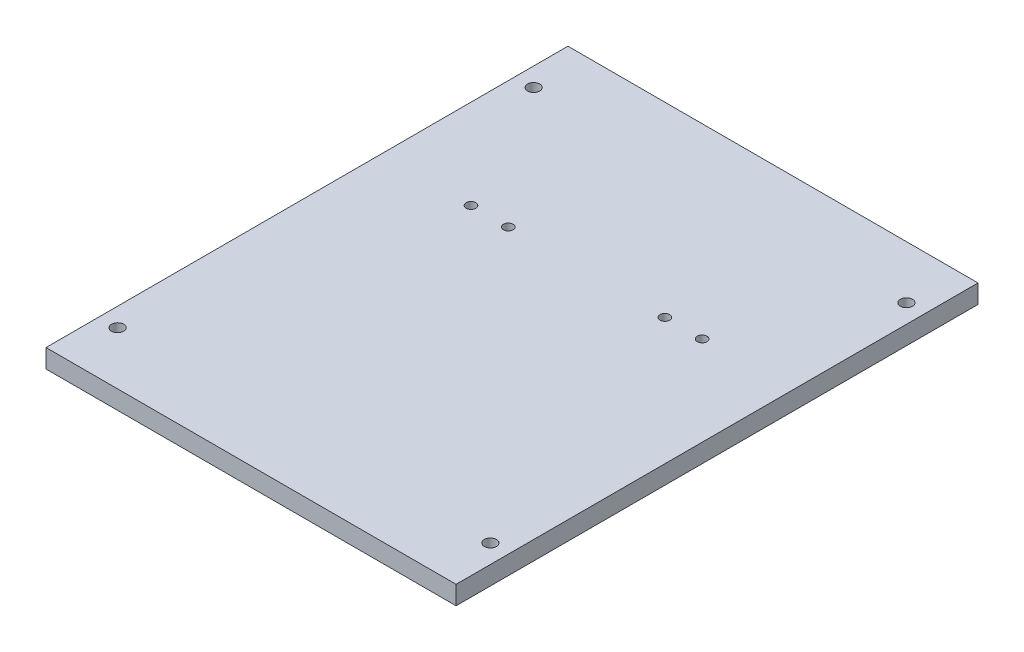
ISO-10303-21;
HEADER;
FILE_DESCRIPTION(('STEP AP214'),'2;1');
FILE_NAME('part.step','',(''),(''),'','','');
FILE_SCHEMA(('AUTOMOTIVE_DESIGN { 1 0 10303 214 1 1 1 1 }'));
ENDSEC;
DATA;
#1=APPLICATION_CONTEXT('core data for automotive mechanical design processes');
#2=APPLICATION_PROTOCOL_DEFINITION('international standard','automotive_design',2000,#1);
#3=PRODUCT_CONTEXT('',#1,'mechanical');
#4=PRODUCT('Part','Part','',(#3));
#5=PRODUCT_RELATED_PRODUCT_CATEGORY('part','',(#4));
#6=PRODUCT_DEFINITION_FORMATION('','',#4);
#7=PRODUCT_DEFINITION_CONTEXT('part definition',#1,'design');
#8=PRODUCT_DEFINITION('design','',#6,#7);
#9=PRODUCT_DEFINITION_SHAPE('','',#8);
#10=(LENGTH_UNIT() NAMED_UNIT(*) SI_UNIT(.MILLI.,.METRE.));
#11=(NAMED_UNIT(*) PLANE_ANGLE_UNIT() SI_UNIT($,.RADIAN.));
#12=(NAMED_UNIT(*) SI_UNIT($,.STERADIAN.) SOLID_ANGLE_UNIT());
#13=UNCERTAINTY_MEASURE_WITH_UNIT(LENGTH_MEASURE(1.E-05),#10,'distance_accuracy_value','');
#14=(GEOMETRIC_REPRESENTATION_CONTEXT(3) GLOBAL_UNCERTAINTY_ASSIGNED_CONTEXT((#13)) GLOBAL_UNIT_ASSIGNED_CONTEXT((#10,
#11,#12)) REPRESENTATION_CONTEXT('',''));
#15=CARTESIAN_POINT('',(0.,0.,0.));
#16=DIRECTION('',(0.,0.,1.));
#17=DIRECTION('',(1.,0.,0.));
#18=AXIS2_PLACEMENT_3D('',#15,#16,#17);
#19=CARTESIAN_POINT('',(0.,6.35,0.));
#20=DIRECTION('',(0.,-1.,0.));
#21=DIRECTION('',(0.,0.,-1.));
#22=AXIS2_PLACEMENT_3D('',#19,#20,#21);
#23=PLANE('',#22);
#24=DIRECTION('',(0.,0.,-1.));
#25=VECTOR('',#24,1.);
#26=CARTESIAN_POINT('',(139.7,6.35,-190.5));
#27=LINE('',#26,#25);
#28=CARTESIAN_POINT('',(139.7,6.35,-12.7));
#29=VERTEX_POINT('',#28);
#30=CARTESIAN_POINT('',(139.7,6.35,-190.5));
#31=VERTEX_POINT('',#30);
#32=EDGE_CURVE('E85',#29,#31,#27,.T.);
#33=ORIENTED_EDGE('',*,*,#32,.T.);
#34=DIRECTION('',(-1.,0.,0.));
#35=VECTOR('',#34,1.);
#36=CARTESIAN_POINT('',(0.,6.35,-190.5));
#37=LINE('',#36,#35);
#38=CARTESIAN_POINT('',(0.,6.35,-190.5));
#39=VERTEX_POINT('',#38);
#40=EDGE_CURVE('E80',#31,#39,#37,.T.);
#41=ORIENTED_EDGE('',*,*,#40,.T.);
#42=DIRECTION('',(0.,0.,1.));
#43=VECTOR('',#42,1.);
#44=CARTESIAN_POINT('',(0.,6.35,-12.7));
#45=LINE('',#44,#43);
#46=CARTESIAN_POINT('',(0.,6.35,-12.7));
#47=VERTEX_POINT('',#46);
#48=EDGE_CURVE('E83',#39,#47,#45,.T.);
#49=ORIENTED_EDGE('',*,*,#48,.T.);
#50=DIRECTION('',(1.,0.,0.));
#51=VECTOR('',#50,1.);
#52=CARTESIAN_POINT('',(139.7,6.35,-12.7));
#53=LINE('',#52,#51);
#54=EDGE_CURVE('E50',#47,#29,#53,.T.);
#55=ORIENTED_EDGE('',*,*,#54,.T.);
#56=EDGE_LOOP('',(#33,#41,#49,#55));
#57=FACE_BOUND('',#56,.T.);
#58=CARTESIAN_POINT('',(133.35,6.35,-172.466));
#59=DIRECTION('',(0.,1.,0.));
#60=DIRECTION('',(0.,0.,1.));
#61=AXIS2_PLACEMENT_3D('',#58,#59,#60);
#62=CIRCLE('',#61,2.08279999999998);
#63=CARTESIAN_POINT('',(133.35,6.35,-170.3832));
#64=VERTEX_POINT('',#63);
#65=EDGE_CURVE('E100',#64,#64,#62,.T.);
#66=ORIENTED_EDGE('',*,*,#65,.F.);
#67=EDGE_LOOP('',(#66));
#68=FACE_BOUND('',#67,.T.);
#69=CARTESIAN_POINT('',(133.35,6.35,-30.734));
#70=DIRECTION('',(0.,1.,0.));
#71=DIRECTION('',(0.,0.,-1.));
#72=AXIS2_PLACEMENT_3D('',#69,#70,#71);
#73=CIRCLE('',#72,2.08279999999999);
#74=CARTESIAN_POINT('',(133.35,6.35,-32.8168));
#75=VERTEX_POINT('',#74);
#76=EDGE_CURVE('E115',#75,#75,#73,.T.);
#77=ORIENTED_EDGE('',*,*,#76,.F.);
#78=EDGE_LOOP('',(#77));
#79=FACE_BOUND('',#78,.T.);
#80=CARTESIAN_POINT('',(6.35000000000002,6.35,-172.466));
#81=DIRECTION('',(0.,1.,0.));
#82=DIRECTION('',(0.,0.,-1.));
#83=AXIS2_PLACEMENT_3D('',#80,#81,#82);
#84=CIRCLE('',#83,2.0828);
#85=CARTESIAN_POINT('',(6.35000000000002,6.35,-174.5488));
#86=VERTEX_POINT('',#85);
#87=EDGE_CURVE('E121',#86,#86,#84,.T.);
#88=ORIENTED_EDGE('',*,*,#87,.F.);
#89=EDGE_LOOP('',(#88));
#90=FACE_BOUND('',#89,.T.);
#91=CARTESIAN_POINT('',(6.35000000000002,6.35,-30.734));
#92=DIRECTION('',(0.,1.,0.));
#93=DIRECTION('',(0.,0.,1.));
#94=AXIS2_PLACEMENT_3D('',#91,#92,#93);
#95=CIRCLE('',#94,2.0828);
#96=CARTESIAN_POINT('',(6.35000000000002,6.35,-28.6512));
#97=VERTEX_POINT('',#96);
#98=EDGE_CURVE('E127',#97,#97,#95,.T.);
#99=ORIENTED_EDGE('',*,*,#98,.F.);
#100=EDGE_LOOP('',(#99));
#101=FACE_BOUND('',#100,.T.);
#102=CARTESIAN_POINT('',(109.22,6.35,-127.));
#103=DIRECTION('',(0.,1.,0.));
#104=DIRECTION('',(0.,0.,1.));
#105=AXIS2_PLACEMENT_3D('',#102,#103,#104);
#106=CIRCLE('',#105,1.65100000000001);
#107=CARTESIAN_POINT('',(109.22,6.35,-125.349));
#108=VERTEX_POINT('',#107);
#109=EDGE_CURVE('E133',#108,#108,#106,.T.);
#110=ORIENTED_EDGE('',*,*,#109,.F.);
#111=EDGE_LOOP('',(#110));
#112=FACE_BOUND('',#111,.T.);
#113=CARTESIAN_POINT('',(96.5199999999999,6.35,-127.));
#114=DIRECTION('',(0.,1.,0.));
#115=DIRECTION('',(0.,0.,1.));
#116=AXIS2_PLACEMENT_3D('',#113,#114,#115);
#117=CIRCLE('',#116,1.65100000000001);
#118=CARTESIAN_POINT('',(96.5199999999999,6.35,-125.349));
#119=VERTEX_POINT('',#118);
#120=EDGE_CURVE('E139',#119,#119,#117,.T.);
#121=ORIENTED_EDGE('',*,*,#120,.F.);
#122=EDGE_LOOP('',(#121));
#123=FACE_BOUND('',#122,.T.);
#124=CARTESIAN_POINT('',(43.18,6.35,-127.));
#125=DIRECTION('',(0.,1.,0.));
#126=DIRECTION('',(0.,0.,-1.));
#127=AXIS2_PLACEMENT_3D('',#124,#125,#126);
#128=CIRCLE('',#127,1.65100000000002);
#129=CARTESIAN_POINT('',(43.18,6.35,-128.651));
#130=VERTEX_POINT('',#129);
#131=EDGE_CURVE('E145',#130,#130,#128,.T.);
#132=ORIENTED_EDGE('',*,*,#131,.F.);
#133=EDGE_LOOP('',(#132));
#134=FACE_BOUND('',#133,.T.);
#135=CARTESIAN_POINT('',(30.48,6.35,-127.));
#136=DIRECTION('',(0.,1.,0.));
#137=DIRECTION('',(0.,0.,-1.));
#138=AXIS2_PLACEMENT_3D('',#135,#136,#137);
#139=CIRCLE('',#138,1.65100000000002);
#140=CARTESIAN_POINT('',(30.48,6.35,-128.651));
#141=VERTEX_POINT('',#140);
#142=EDGE_CURVE('E151',#141,#141,#139,.T.);
#143=ORIENTED_EDGE('',*,*,#142,.F.);
#144=EDGE_LOOP('',(#143));
#145=FACE_BOUND('',#144,.T.);
#146=ADVANCED_FACE('F33',(#57,#68,#79,#90,#101,#112,#123,#134,#145),#23,.F.);
#147=CARTESIAN_POINT('',(0.,0.,0.));
#148=DIRECTION('',(0.,-1.,0.));
#149=DIRECTION('',(0.,0.,-1.));
#150=AXIS2_PLACEMENT_3D('',#147,#148,#149);
#151=PLANE('',#150);
#152=CARTESIAN_POINT('',(43.18,0.,-127.));
#153=DIRECTION('',(0.,1.,0.));
#154=DIRECTION('',(0.,0.,-1.));
#155=AXIS2_PLACEMENT_3D('',#152,#153,#154);
#156=CIRCLE('',#155,1.65100000000002);
#157=CARTESIAN_POINT('',(43.18,0.,-128.651));
#158=VERTEX_POINT('',#157);
#159=EDGE_CURVE('E148',#158,#158,#156,.T.);
#160=ORIENTED_EDGE('',*,*,#159,.T.);
#161=EDGE_LOOP('',(#160));
#162=FACE_BOUND('',#161,.T.);
#163=CARTESIAN_POINT('',(109.22,0.,-127.));
#164=DIRECTION('',(0.,1.,0.));
#165=DIRECTION('',(0.,0.,1.));
#166=AXIS2_PLACEMENT_3D('',#163,#164,#165);
#167=CIRCLE('',#166,1.65100000000001);
#168=CARTESIAN_POINT('',(109.22,0.,-125.349));
#169=VERTEX_POINT('',#168);
#170=EDGE_CURVE('E136',#169,#169,#167,.T.);
#171=ORIENTED_EDGE('',*,*,#170,.T.);
#172=EDGE_LOOP('',(#171));
#173=FACE_BOUND('',#172,.T.);
#174=CARTESIAN_POINT('',(6.35000000000002,0.,-172.466));
#175=DIRECTION('',(0.,1.,0.));
#176=DIRECTION('',(0.,0.,-1.));
#177=AXIS2_PLACEMENT_3D('',#174,#175,#176);
#178=CIRCLE('',#177,2.0828);
#179=CARTESIAN_POINT('',(6.35000000000002,0.,-174.5488));
#180=VERTEX_POINT('',#179);
#181=EDGE_CURVE('E124',#180,#180,#178,.T.);
#182=ORIENTED_EDGE('',*,*,#181,.T.);
#183=EDGE_LOOP('',(#182));
#184=FACE_BOUND('',#183,.T.);
#185=CARTESIAN_POINT('',(133.35,0.,-172.466));
#186=DIRECTION('',(0.,1.,0.));
#187=DIRECTION('',(0.,0.,1.));
#188=AXIS2_PLACEMENT_3D('',#185,#186,#187);
#189=CIRCLE('',#188,2.08279999999998);
#190=CARTESIAN_POINT('',(133.35,0.,-170.3832));
#191=VERTEX_POINT('',#190);
#192=EDGE_CURVE('E112',#191,#191,#189,.T.);
#193=ORIENTED_EDGE('',*,*,#192,.T.);
#194=EDGE_LOOP('',(#193));
#195=FACE_BOUND('',#194,.T.);
#196=DIRECTION('',(0.,0.,-1.));
#197=VECTOR('',#196,1.);
#198=CARTESIAN_POINT('',(139.7,0.,-190.5));
#199=LINE('',#198,#197);
#200=CARTESIAN_POINT('',(139.7,0.,-12.7));
#201=VERTEX_POINT('',#200);
#202=CARTESIAN_POINT('',(139.7,0.,-190.5));
#203=VERTEX_POINT('',#202);
#204=EDGE_CURVE('E97',#201,#203,#199,.T.);
#205=ORIENTED_EDGE('',*,*,#204,.F.);
#206=DIRECTION('',(1.,0.,0.));
#207=VECTOR('',#206,1.);
#208=CARTESIAN_POINT('',(139.7,0.,-12.7));
#209=LINE('',#208,#207);
#210=CARTESIAN_POINT('',(0.,0.,-12.7));
#211=VERTEX_POINT('',#210);
#212=EDGE_CURVE('E73',#211,#201,#209,.T.);
#213=ORIENTED_EDGE('',*,*,#212,.F.);
#214=DIRECTION('',(0.,0.,1.));
#215=VECTOR('',#214,1.);
#216=CARTESIAN_POINT('',(0.,0.,-12.7));
#217=LINE('',#216,#215);
#218=CARTESIAN_POINT('',(0.,0.,-190.5));
#219=VERTEX_POINT('',#218);
#220=EDGE_CURVE('E67',#219,#211,#217,.T.);
#221=ORIENTED_EDGE('',*,*,#220,.F.);
#222=DIRECTION('',(-1.,0.,0.));
#223=VECTOR('',#222,1.);
#224=CARTESIAN_POINT('',(0.,0.,-190.5));
#225=LINE('',#224,#223);
#226=EDGE_CURVE('E89',#203,#219,#225,.T.);
#227=ORIENTED_EDGE('',*,*,#226,.F.);
#228=EDGE_LOOP('',(#205,#213,#221,#227));
#229=FACE_BOUND('',#228,.T.);
#230=CARTESIAN_POINT('',(133.35,0.,-30.734));
#231=DIRECTION('',(0.,1.,0.));
#232=DIRECTION('',(0.,0.,-1.));
#233=AXIS2_PLACEMENT_3D('',#230,#231,#232);
#234=CIRCLE('',#233,2.08279999999999);
#235=CARTESIAN_POINT('',(133.35,0.,-32.8168));
#236=VERTEX_POINT('',#235);
#237=EDGE_CURVE('E118',#236,#236,#234,.T.);
#238=ORIENTED_EDGE('',*,*,#237,.T.);
#239=EDGE_LOOP('',(#238));
#240=FACE_BOUND('',#239,.T.);
#241=CARTESIAN_POINT('',(6.35000000000002,0.,-30.734));
#242=DIRECTION('',(0.,1.,0.));
#243=DIRECTION('',(0.,0.,1.));
#244=AXIS2_PLACEMENT_3D('',#241,#242,#243);
#245=CIRCLE('',#244,2.0828);
#246=CARTESIAN_POINT('',(6.35000000000002,0.,-28.6512));
#247=VERTEX_POINT('',#246);
#248=EDGE_CURVE('E130',#247,#247,#245,.T.);
#249=ORIENTED_EDGE('',*,*,#248,.T.);
#250=EDGE_LOOP('',(#249));
#251=FACE_BOUND('',#250,.T.);
#252=CARTESIAN_POINT('',(96.5199999999999,0.,-127.));
#253=DIRECTION('',(0.,1.,0.));
#254=DIRECTION('',(0.,0.,1.));
#255=AXIS2_PLACEMENT_3D('',#252,#253,#254);
#256=CIRCLE('',#255,1.65100000000001);
#257=CARTESIAN_POINT('',(96.5199999999999,0.,-125.349));
#258=VERTEX_POINT('',#257);
#259=EDGE_CURVE('E142',#258,#258,#256,.T.);
#260=ORIENTED_EDGE('',*,*,#259,.T.);
#261=EDGE_LOOP('',(#260));
#262=FACE_BOUND('',#261,.T.);
#263=CARTESIAN_POINT('',(30.48,0.,-127.));
#264=DIRECTION('',(0.,1.,0.));
#265=DIRECTION('',(0.,0.,-1.));
#266=AXIS2_PLACEMENT_3D('',#263,#264,#265);
#267=CIRCLE('',#266,1.65100000000002);
#268=CARTESIAN_POINT('',(30.48,0.,-128.651));
#269=VERTEX_POINT('',#268);
#270=EDGE_CURVE('E154',#269,#269,#267,.T.);
#271=ORIENTED_EDGE('',*,*,#270,.T.);
#272=EDGE_LOOP('',(#271));
#273=FACE_BOUND('',#272,.T.);
#274=ADVANCED_FACE('F108',(#162,#173,#184,#195,#229,#240,#251,#262,#273),#151,.T.);
#275=CARTESIAN_POINT('',(139.7,6.35,-190.5));
#276=DIRECTION('',(-1.,0.,0.));
#277=DIRECTION('',(0.,0.,1.));
#278=AXIS2_PLACEMENT_3D('',#275,#276,#277);
#279=PLANE('',#278);
#280=ORIENTED_EDGE('',*,*,#204,.T.);
#281=DIRECTION('',(0.,-1.,0.));
#282=VECTOR('',#281,1.);
#283=CARTESIAN_POINT('',(139.7,6.35,-190.5));
#284=LINE('',#283,#282);
#285=EDGE_CURVE('E11',#31,#203,#284,.T.);
#286=ORIENTED_EDGE('',*,*,#285,.F.);
#287=ORIENTED_EDGE('',*,*,#32,.F.);
#288=DIRECTION('',(0.,-1.,0.));
#289=VECTOR('',#288,1.);
#290=CARTESIAN_POINT('',(139.7,6.35,-12.7));
#291=LINE('',#290,#289);
#292=EDGE_CURVE('E93',#29,#201,#291,.T.);
#293=ORIENTED_EDGE('',*,*,#292,.T.);
#294=EDGE_LOOP('',(#280,#286,#287,#293));
#295=FACE_BOUND('',#294,.T.);
#296=ADVANCED_FACE('F35',(#295),#279,.F.);
#297=CARTESIAN_POINT('',(0.,6.35,-190.5));
#298=DIRECTION('',(0.,0.,1.));
#299=DIRECTION('',(1.,0.,0.));
#300=AXIS2_PLACEMENT_3D('',#297,#298,#299);
#301=PLANE('',#300);
#302=ORIENTED_EDGE('',*,*,#226,.T.);
#303=DIRECTION('',(0.,-1.,0.));
#304=VECTOR('',#303,1.);
#305=CARTESIAN_POINT('',(0.,6.35,-190.5));
#306=LINE('',#305,#304);
#307=EDGE_CURVE('E42',#39,#219,#306,.T.);
#308=ORIENTED_EDGE('',*,*,#307,.F.);
#309=ORIENTED_EDGE('',*,*,#40,.F.);
#310=ORIENTED_EDGE('',*,*,#285,.T.);
#311=EDGE_LOOP('',(#302,#308,#309,#310));
#312=FACE_BOUND('',#311,.T.);
#313=ADVANCED_FACE('F88',(#312),#301,.F.);
#314=CARTESIAN_POINT('',(0.,6.35,-12.7));
#315=DIRECTION('',(1.,0.,0.));
#316=DIRECTION('',(0.,0.,-1.));
#317=AXIS2_PLACEMENT_3D('',#314,#315,#316);
#318=PLANE('',#317);
#319=ORIENTED_EDGE('',*,*,#220,.T.);
#320=DIRECTION('',(0.,-1.,0.));
#321=VECTOR('',#320,1.);
#322=CARTESIAN_POINT('',(0.,6.35,-12.7));
#323=LINE('',#322,#321);
#324=EDGE_CURVE('E90',#47,#211,#323,.T.);
#325=ORIENTED_EDGE('',*,*,#324,.F.);
#326=ORIENTED_EDGE('',*,*,#48,.F.);
#327=ORIENTED_EDGE('',*,*,#307,.T.);
#328=EDGE_LOOP('',(#319,#325,#326,#327));
#329=FACE_BOUND('',#328,.T.);
#330=ADVANCED_FACE('F91',(#329),#318,.F.);
#331=CARTESIAN_POINT('',(139.7,6.35,-12.7));
#332=DIRECTION('',(0.,0.,-1.));
#333=DIRECTION('',(-1.,0.,0.));
#334=AXIS2_PLACEMENT_3D('',#331,#332,#333);
#335=PLANE('',#334);
#336=ORIENTED_EDGE('',*,*,#212,.T.);
#337=ORIENTED_EDGE('',*,*,#292,.F.);
#338=ORIENTED_EDGE('',*,*,#54,.F.);
#339=ORIENTED_EDGE('',*,*,#324,.T.);
#340=EDGE_LOOP('',(#336,#337,#338,#339));
#341=FACE_BOUND('',#340,.T.);
#342=ADVANCED_FACE('F105',(#341),#335,.F.);
#343=CARTESIAN_POINT('',(133.35,6.35,-172.466));
#344=DIRECTION('',(0.,-1.,0.));
#345=DIRECTION('',(0.,0.,-1.));
#346=AXIS2_PLACEMENT_3D('',#343,#344,#345);
#347=CYLINDRICAL_SURFACE('',#346,2.08279999999998);
#348=ORIENTED_EDGE('',*,*,#65,.T.);
#349=EDGE_LOOP('',(#348));
#350=FACE_BOUND('',#349,.T.);
#351=ORIENTED_EDGE('',*,*,#192,.F.);
#352=EDGE_LOOP('',(#351));
#353=FACE_BOUND('',#352,.T.);
#354=ADVANCED_FACE('F171',(#350,#353),#347,.F.);
#355=CARTESIAN_POINT('',(133.35,6.35,-30.734));
#356=DIRECTION('',(0.,-1.,0.));
#357=DIRECTION('',(0.,0.,-1.));
#358=AXIS2_PLACEMENT_3D('',#355,#356,#357);
#359=CYLINDRICAL_SURFACE('',#358,2.08279999999999);
#360=ORIENTED_EDGE('',*,*,#76,.T.);
#361=EDGE_LOOP('',(#360));
#362=FACE_BOUND('',#361,.T.);
#363=ORIENTED_EDGE('',*,*,#237,.F.);
#364=EDGE_LOOP('',(#363));
#365=FACE_BOUND('',#364,.T.);
#366=ADVANCED_FACE('F217',(#362,#365),#359,.F.);
#367=CARTESIAN_POINT('',(6.35000000000002,6.35,-172.466));
#368=DIRECTION('',(0.,-1.,0.));
#369=DIRECTION('',(0.,0.,-1.));
#370=AXIS2_PLACEMENT_3D('',#367,#368,#369);
#371=CYLINDRICAL_SURFACE('',#370,2.0828);
#372=ORIENTED_EDGE('',*,*,#87,.T.);
#373=EDGE_LOOP('',(#372));
#374=FACE_BOUND('',#373,.T.);
#375=ORIENTED_EDGE('',*,*,#181,.F.);
#376=EDGE_LOOP('',(#375));
#377=FACE_BOUND('',#376,.T.);
#378=ADVANCED_FACE('F225',(#374,#377),#371,.F.);
#379=CARTESIAN_POINT('',(6.35000000000002,6.35,-30.734));
#380=DIRECTION('',(0.,-1.,0.));
#381=DIRECTION('',(0.,0.,-1.));
#382=AXIS2_PLACEMENT_3D('',#379,#380,#381);
#383=CYLINDRICAL_SURFACE('',#382,2.0828);
#384=ORIENTED_EDGE('',*,*,#98,.T.);
#385=EDGE_LOOP('',(#384));
#386=FACE_BOUND('',#385,.T.);
#387=ORIENTED_EDGE('',*,*,#248,.F.);
#388=EDGE_LOOP('',(#387));
#389=FACE_BOUND('',#388,.T.);
#390=ADVANCED_FACE('F233',(#386,#389),#383,.F.);
#391=CARTESIAN_POINT('',(109.22,6.35,-127.));
#392=DIRECTION('',(0.,-1.,0.));
#393=DIRECTION('',(0.,0.,-1.));
#394=AXIS2_PLACEMENT_3D('',#391,#392,#393);
#395=CYLINDRICAL_SURFACE('',#394,1.65100000000001);
#396=ORIENTED_EDGE('',*,*,#109,.T.);
#397=EDGE_LOOP('',(#396));
#398=FACE_BOUND('',#397,.T.);
#399=ORIENTED_EDGE('',*,*,#170,.F.);
#400=EDGE_LOOP('',(#399));
#401=FACE_BOUND('',#400,.T.);
#402=ADVANCED_FACE('F242',(#398,#401),#395,.F.);
#403=CARTESIAN_POINT('',(96.5199999999999,6.35,-127.));
#404=DIRECTION('',(0.,-1.,0.));
#405=DIRECTION('',(0.,0.,-1.));
#406=AXIS2_PLACEMENT_3D('',#403,#404,#405);
#407=CYLINDRICAL_SURFACE('',#406,1.65100000000001);
#408=ORIENTED_EDGE('',*,*,#120,.T.);
#409=EDGE_LOOP('',(#408));
#410=FACE_BOUND('',#409,.T.);
#411=ORIENTED_EDGE('',*,*,#259,.F.);
#412=EDGE_LOOP('',(#411));
#413=FACE_BOUND('',#412,.T.);
#414=ADVANCED_FACE('F251',(#410,#413),#407,.F.);
#415=CARTESIAN_POINT('',(43.18,6.35,-127.));
#416=DIRECTION('',(0.,-1.,0.));
#417=DIRECTION('',(0.,0.,-1.));
#418=AXIS2_PLACEMENT_3D('',#415,#416,#417);
#419=CYLINDRICAL_SURFACE('',#418,1.65100000000002);
#420=ORIENTED_EDGE('',*,*,#131,.T.);
#421=EDGE_LOOP('',(#420));
#422=FACE_BOUND('',#421,.T.);
#423=ORIENTED_EDGE('',*,*,#159,.F.);
#424=EDGE_LOOP('',(#423));
#425=FACE_BOUND('',#424,.T.);
#426=ADVANCED_FACE('F260',(#422,#425),#419,.F.);
#427=CARTESIAN_POINT('',(30.48,6.35,-127.));
#428=DIRECTION('',(0.,-1.,0.));
#429=DIRECTION('',(0.,0.,-1.));
#430=AXIS2_PLACEMENT_3D('',#427,#428,#429);
#431=CYLINDRICAL_SURFACE('',#430,1.65100000000002);
#432=ORIENTED_EDGE('',*,*,#142,.T.);
#433=EDGE_LOOP('',(#432));
#434=FACE_BOUND('',#433,.T.);
#435=ORIENTED_EDGE('',*,*,#270,.F.);
#436=EDGE_LOOP('',(#435));
#437=FACE_BOUND('',#436,.T.);
#438=ADVANCED_FACE('F160',(#434,#437),#431,.F.);
#439=CLOSED_SHELL('',(#146,#274,#296,#313,#330,#342,#354,#366,#378,#390,#402,#414,#426,#438));
#440=MANIFOLD_SOLID_BREP('B2',#439);
#441=ADVANCED_BREP_SHAPE_REPRESENTATION('',(#18,#440),#14);
#442=SHAPE_DEFINITION_REPRESENTATION(#9,#441);
ENDSEC;
END-ISO-10303-21;
